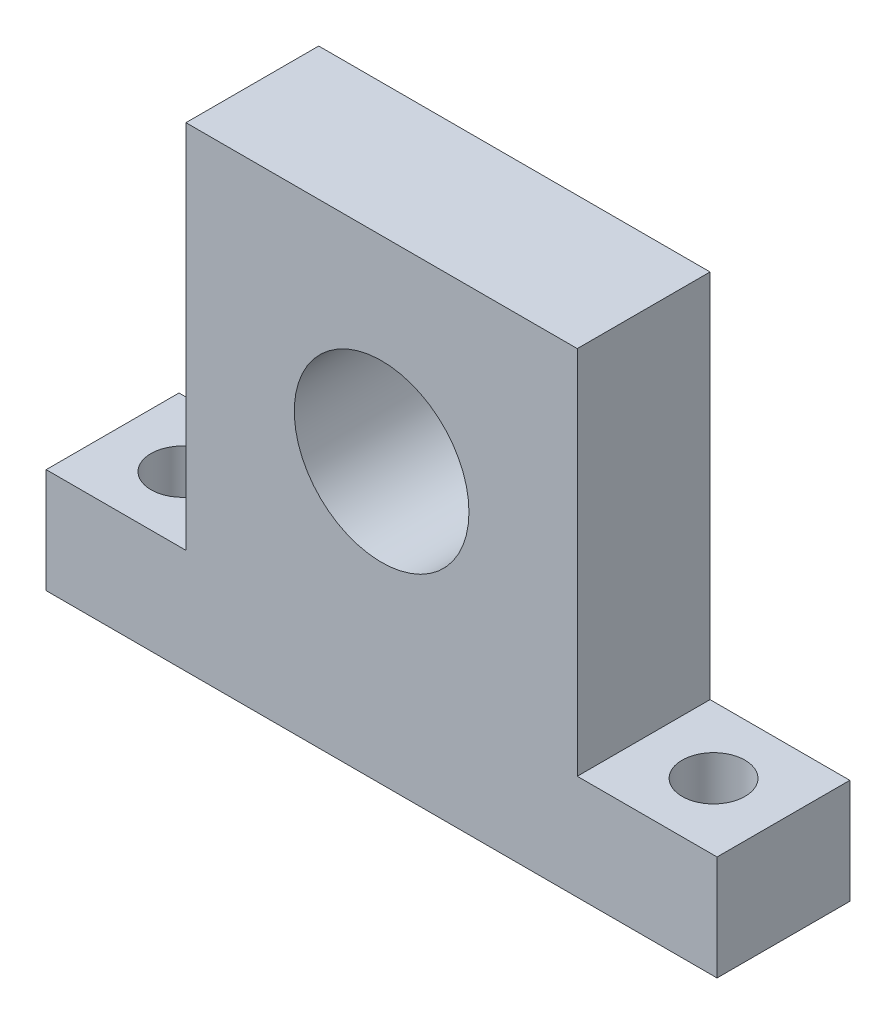
ISO-10303-21;
HEADER;
FILE_DESCRIPTION(('STEP AP214'),'2;1');
FILE_NAME('part.step','',(''),(''),'','','');
FILE_SCHEMA(('AUTOMOTIVE_DESIGN { 1 0 10303 214 1 1 1 1 }'));
ENDSEC;
DATA;
#1=APPLICATION_CONTEXT('core data for automotive mechanical design processes');
#2=APPLICATION_PROTOCOL_DEFINITION('international standard','automotive_design',2000,#1);
#3=PRODUCT_CONTEXT('',#1,'mechanical');
#4=PRODUCT('Part','Part','',(#3));
#5=PRODUCT_RELATED_PRODUCT_CATEGORY('part','',(#4));
#6=PRODUCT_DEFINITION_FORMATION('','',#4);
#7=PRODUCT_DEFINITION_CONTEXT('part definition',#1,'design');
#8=PRODUCT_DEFINITION('design','',#6,#7);
#9=PRODUCT_DEFINITION_SHAPE('','',#8);
#10=(LENGTH_UNIT() NAMED_UNIT(*) SI_UNIT(.MILLI.,.METRE.));
#11=(NAMED_UNIT(*) PLANE_ANGLE_UNIT() SI_UNIT($,.RADIAN.));
#12=(NAMED_UNIT(*) SI_UNIT($,.STERADIAN.) SOLID_ANGLE_UNIT());
#13=UNCERTAINTY_MEASURE_WITH_UNIT(LENGTH_MEASURE(1.E-05),#10,'distance_accuracy_value','');
#14=(GEOMETRIC_REPRESENTATION_CONTEXT(3) GLOBAL_UNCERTAINTY_ASSIGNED_CONTEXT((#13)) GLOBAL_UNIT_ASSIGNED_CONTEXT((#10,
#11,#12)) REPRESENTATION_CONTEXT('',''));
#15=CARTESIAN_POINT('',(0.,0.,0.));
#16=DIRECTION('',(0.,0.,1.));
#17=DIRECTION('',(1.,0.,0.));
#18=AXIS2_PLACEMENT_3D('',#15,#16,#17);
#19=CARTESIAN_POINT('',(0.,0.,19.));
#20=DIRECTION('',(0.,0.,1.));
#21=DIRECTION('',(1.,0.,0.));
#22=AXIS2_PLACEMENT_3D('',#19,#20,#21);
#23=PLANE('',#22);
#24=DIRECTION('',(1.,0.,0.));
#25=VECTOR('',#24,1.);
#26=CARTESIAN_POINT('',(-48.,-40.,19.));
#27=LINE('',#26,#25);
#28=CARTESIAN_POINT('',(-48.,-40.,19.));
#29=VERTEX_POINT('',#28);
#30=CARTESIAN_POINT('',(48.,-40.,19.));
#31=VERTEX_POINT('',#30);
#32=EDGE_CURVE('E153',#29,#31,#27,.T.);
#33=ORIENTED_EDGE('',*,*,#32,.T.);
#34=DIRECTION('',(0.,1.,0.));
#35=VECTOR('',#34,1.);
#36=CARTESIAN_POINT('',(48.,-40.,19.));
#37=LINE('',#36,#35);
#38=CARTESIAN_POINT('',(48.,-25.,19.));
#39=VERTEX_POINT('',#38);
#40=EDGE_CURVE('E101',#31,#39,#37,.T.);
#41=ORIENTED_EDGE('',*,*,#40,.T.);
#42=DIRECTION('',(-1.,0.,0.));
#43=VECTOR('',#42,1.);
#44=CARTESIAN_POINT('',(48.,-25.,19.));
#45=LINE('',#44,#43);
#46=CARTESIAN_POINT('',(28.,-25.,19.));
#47=VERTEX_POINT('',#46);
#48=EDGE_CURVE('E168',#39,#47,#45,.T.);
#49=ORIENTED_EDGE('',*,*,#48,.T.);
#50=DIRECTION('',(0.,1.,0.));
#51=VECTOR('',#50,1.);
#52=CARTESIAN_POINT('',(28.,-25.,19.));
#53=LINE('',#52,#51);
#54=CARTESIAN_POINT('',(28.,28.,19.));
#55=VERTEX_POINT('',#54);
#56=EDGE_CURVE('E181',#47,#55,#53,.T.);
#57=ORIENTED_EDGE('',*,*,#56,.T.);
#58=DIRECTION('',(-1.,0.,0.));
#59=VECTOR('',#58,1.);
#60=CARTESIAN_POINT('',(-28.,28.,19.));
#61=LINE('',#60,#59);
#62=CARTESIAN_POINT('',(-28.,28.,19.));
#63=VERTEX_POINT('',#62);
#64=EDGE_CURVE('E120',#55,#63,#61,.T.);
#65=ORIENTED_EDGE('',*,*,#64,.T.);
#66=DIRECTION('',(0.,-1.,0.));
#67=VECTOR('',#66,1.);
#68=CARTESIAN_POINT('',(-28.,-25.,19.));
#69=LINE('',#68,#67);
#70=CARTESIAN_POINT('',(-28.,-25.,19.));
#71=VERTEX_POINT('',#70);
#72=EDGE_CURVE('E114',#63,#71,#69,.T.);
#73=ORIENTED_EDGE('',*,*,#72,.T.);
#74=DIRECTION('',(-1.,0.,0.));
#75=VECTOR('',#74,1.);
#76=CARTESIAN_POINT('',(-48.,-25.,19.));
#77=LINE('',#76,#75);
#78=CARTESIAN_POINT('',(-48.,-25.,19.));
#79=VERTEX_POINT('',#78);
#80=EDGE_CURVE('E118',#71,#79,#77,.T.);
#81=ORIENTED_EDGE('',*,*,#80,.T.);
#82=DIRECTION('',(0.,-1.,0.));
#83=VECTOR('',#82,1.);
#84=CARTESIAN_POINT('',(-48.,-40.,19.));
#85=LINE('',#84,#83);
#86=EDGE_CURVE('E58',#79,#29,#85,.T.);
#87=ORIENTED_EDGE('',*,*,#86,.T.);
#88=EDGE_LOOP('',(#33,#41,#49,#57,#65,#73,#81,#87));
#89=FACE_BOUND('',#88,.T.);
#90=CARTESIAN_POINT('',(0.,0.,19.));
#91=DIRECTION('',(0.,0.,1.));
#92=DIRECTION('',(1.,0.,0.));
#93=AXIS2_PLACEMENT_3D('',#90,#91,#92);
#94=CIRCLE('',#93,12.5);
#95=CARTESIAN_POINT('',(12.5,0.,19.));
#96=VERTEX_POINT('',#95);
#97=EDGE_CURVE('E142',#96,#96,#94,.T.);
#98=ORIENTED_EDGE('',*,*,#97,.F.);
#99=EDGE_LOOP('',(#98));
#100=FACE_BOUND('',#99,.T.);
#101=ADVANCED_FACE('F41',(#89,#100),#23,.T.);
#102=CARTESIAN_POINT('',(0.,0.,0.));
#103=DIRECTION('',(0.,0.,1.));
#104=DIRECTION('',(1.,0.,0.));
#105=AXIS2_PLACEMENT_3D('',#102,#103,#104);
#106=PLANE('',#105);
#107=DIRECTION('',(1.,0.,0.));
#108=VECTOR('',#107,1.);
#109=CARTESIAN_POINT('',(-48.,-40.,0.));
#110=LINE('',#109,#108);
#111=CARTESIAN_POINT('',(-48.,-40.,0.));
#112=VERTEX_POINT('',#111);
#113=CARTESIAN_POINT('',(48.,-40.,0.));
#114=VERTEX_POINT('',#113);
#115=EDGE_CURVE('E138',#112,#114,#110,.T.);
#116=ORIENTED_EDGE('',*,*,#115,.F.);
#117=DIRECTION('',(0.,-1.,0.));
#118=VECTOR('',#117,1.);
#119=CARTESIAN_POINT('',(-48.,-40.,0.));
#120=LINE('',#119,#118);
#121=CARTESIAN_POINT('',(-48.,-25.,0.));
#122=VERTEX_POINT('',#121);
#123=EDGE_CURVE('E93',#122,#112,#120,.T.);
#124=ORIENTED_EDGE('',*,*,#123,.F.);
#125=DIRECTION('',(-1.,0.,0.));
#126=VECTOR('',#125,1.);
#127=CARTESIAN_POINT('',(-48.,-25.,0.));
#128=LINE('',#127,#126);
#129=CARTESIAN_POINT('',(-28.,-25.,0.));
#130=VERTEX_POINT('',#129);
#131=EDGE_CURVE('E87',#130,#122,#128,.T.);
#132=ORIENTED_EDGE('',*,*,#131,.F.);
#133=DIRECTION('',(0.,-1.,0.));
#134=VECTOR('',#133,1.);
#135=CARTESIAN_POINT('',(-28.,-25.,0.));
#136=LINE('',#135,#134);
#137=CARTESIAN_POINT('',(-28.,28.,0.));
#138=VERTEX_POINT('',#137);
#139=EDGE_CURVE('E128',#138,#130,#136,.T.);
#140=ORIENTED_EDGE('',*,*,#139,.F.);
#141=DIRECTION('',(-1.,0.,0.));
#142=VECTOR('',#141,1.);
#143=CARTESIAN_POINT('',(-28.,28.,0.));
#144=LINE('',#143,#142);
#145=CARTESIAN_POINT('',(28.,28.,0.));
#146=VERTEX_POINT('',#145);
#147=EDGE_CURVE('E148',#146,#138,#144,.T.);
#148=ORIENTED_EDGE('',*,*,#147,.F.);
#149=DIRECTION('',(0.,1.,0.));
#150=VECTOR('',#149,1.);
#151=CARTESIAN_POINT('',(28.,-25.,0.));
#152=LINE('',#151,#150);
#153=CARTESIAN_POINT('',(28.,-25.,0.));
#154=VERTEX_POINT('',#153);
#155=EDGE_CURVE('E146',#154,#146,#152,.T.);
#156=ORIENTED_EDGE('',*,*,#155,.F.);
#157=DIRECTION('',(-1.,0.,0.));
#158=VECTOR('',#157,1.);
#159=CARTESIAN_POINT('',(48.,-25.,0.));
#160=LINE('',#159,#158);
#161=CARTESIAN_POINT('',(48.,-25.,0.));
#162=VERTEX_POINT('',#161);
#163=EDGE_CURVE('E144',#162,#154,#160,.T.);
#164=ORIENTED_EDGE('',*,*,#163,.F.);
#165=DIRECTION('',(0.,1.,0.));
#166=VECTOR('',#165,1.);
#167=CARTESIAN_POINT('',(48.,-40.,0.));
#168=LINE('',#167,#166);
#169=EDGE_CURVE('E141',#114,#162,#168,.T.);
#170=ORIENTED_EDGE('',*,*,#169,.F.);
#171=EDGE_LOOP('',(#116,#124,#132,#140,#148,#156,#164,#170));
#172=FACE_BOUND('',#171,.T.);
#173=CARTESIAN_POINT('',(0.,0.,0.));
#174=DIRECTION('',(0.,0.,1.));
#175=DIRECTION('',(1.,0.,0.));
#176=AXIS2_PLACEMENT_3D('',#173,#174,#175);
#177=CIRCLE('',#176,12.5);
#178=CARTESIAN_POINT('',(12.5,0.,0.));
#179=VERTEX_POINT('',#178);
#180=EDGE_CURVE('E187',#179,#179,#177,.T.);
#181=ORIENTED_EDGE('',*,*,#180,.T.);
#182=EDGE_LOOP('',(#181));
#183=FACE_BOUND('',#182,.T.);
#184=ADVANCED_FACE('F172',(#172,#183),#106,.F.);
#185=CARTESIAN_POINT('',(-48.,-40.,19.));
#186=DIRECTION('',(0.,1.,0.));
#187=DIRECTION('',(0.,0.,1.));
#188=AXIS2_PLACEMENT_3D('',#185,#186,#187);
#189=PLANE('',#188);
#190=CARTESIAN_POINT('',(-38.,-40.,9.5));
#191=DIRECTION('',(0.,1.,0.));
#192=DIRECTION('',(0.,0.,1.));
#193=AXIS2_PLACEMENT_3D('',#190,#191,#192);
#194=CIRCLE('',#193,4.5);
#195=CARTESIAN_POINT('',(-38.,-40.,14.));
#196=VERTEX_POINT('',#195);
#197=EDGE_CURVE('E190',#196,#196,#194,.T.);
#198=ORIENTED_EDGE('',*,*,#197,.T.);
#199=EDGE_LOOP('',(#198));
#200=FACE_BOUND('',#199,.T.);
#201=CARTESIAN_POINT('',(38.,-40.,9.50000000000002));
#202=DIRECTION('',(0.,1.,0.));
#203=DIRECTION('',(0.,0.,-1.));
#204=AXIS2_PLACEMENT_3D('',#201,#202,#203);
#205=CIRCLE('',#204,4.5);
#206=CARTESIAN_POINT('',(38.,-40.,5.00000000000002));
#207=VERTEX_POINT('',#206);
#208=EDGE_CURVE('E193',#207,#207,#205,.T.);
#209=ORIENTED_EDGE('',*,*,#208,.T.);
#210=EDGE_LOOP('',(#209));
#211=FACE_BOUND('',#210,.T.);
#212=ORIENTED_EDGE('',*,*,#115,.T.);
#213=DIRECTION('',(0.,0.,-1.));
#214=VECTOR('',#213,1.);
#215=CARTESIAN_POINT('',(48.,-40.,19.));
#216=LINE('',#215,#214);
#217=EDGE_CURVE('E11',#31,#114,#216,.T.);
#218=ORIENTED_EDGE('',*,*,#217,.F.);
#219=ORIENTED_EDGE('',*,*,#32,.F.);
#220=DIRECTION('',(0.,0.,-1.));
#221=VECTOR('',#220,1.);
#222=CARTESIAN_POINT('',(-48.,-40.,19.));
#223=LINE('',#222,#221);
#224=EDGE_CURVE('E134',#29,#112,#223,.T.);
#225=ORIENTED_EDGE('',*,*,#224,.T.);
#226=EDGE_LOOP('',(#212,#218,#219,#225));
#227=FACE_BOUND('',#226,.T.);
#228=ADVANCED_FACE('F43',(#200,#211,#227),#189,.F.);
#229=CARTESIAN_POINT('',(48.,-40.,19.));
#230=DIRECTION('',(-1.,0.,0.));
#231=DIRECTION('',(0.,0.,1.));
#232=AXIS2_PLACEMENT_3D('',#229,#230,#231);
#233=PLANE('',#232);
#234=ORIENTED_EDGE('',*,*,#169,.T.);
#235=DIRECTION('',(0.,0.,-1.));
#236=VECTOR('',#235,1.);
#237=CARTESIAN_POINT('',(48.,-25.,19.));
#238=LINE('',#237,#236);
#239=EDGE_CURVE('E50',#39,#162,#238,.T.);
#240=ORIENTED_EDGE('',*,*,#239,.F.);
#241=ORIENTED_EDGE('',*,*,#40,.F.);
#242=ORIENTED_EDGE('',*,*,#217,.T.);
#243=EDGE_LOOP('',(#234,#240,#241,#242));
#244=FACE_BOUND('',#243,.T.);
#245=ADVANCED_FACE('F243',(#244),#233,.F.);
#246=CARTESIAN_POINT('',(48.,-25.,19.));
#247=DIRECTION('',(0.,-1.,0.));
#248=DIRECTION('',(0.,0.,-1.));
#249=AXIS2_PLACEMENT_3D('',#246,#247,#248);
#250=PLANE('',#249);
#251=CARTESIAN_POINT('',(38.,-25.,9.50000000000002));
#252=DIRECTION('',(0.,1.,0.));
#253=DIRECTION('',(0.,0.,-1.));
#254=AXIS2_PLACEMENT_3D('',#251,#252,#253);
#255=CIRCLE('',#254,4.5);
#256=CARTESIAN_POINT('',(38.,-25.,5.00000000000002));
#257=VERTEX_POINT('',#256);
#258=EDGE_CURVE('E196',#257,#257,#255,.T.);
#259=ORIENTED_EDGE('',*,*,#258,.F.);
#260=EDGE_LOOP('',(#259));
#261=FACE_BOUND('',#260,.T.);
#262=ORIENTED_EDGE('',*,*,#163,.T.);
#263=DIRECTION('',(0.,0.,-1.));
#264=VECTOR('',#263,1.);
#265=CARTESIAN_POINT('',(28.,-25.,19.));
#266=LINE('',#265,#264);
#267=EDGE_CURVE('E160',#47,#154,#266,.T.);
#268=ORIENTED_EDGE('',*,*,#267,.F.);
#269=ORIENTED_EDGE('',*,*,#48,.F.);
#270=ORIENTED_EDGE('',*,*,#239,.T.);
#271=EDGE_LOOP('',(#262,#268,#269,#270));
#272=FACE_BOUND('',#271,.T.);
#273=ADVANCED_FACE('F166',(#261,#272),#250,.F.);
#274=CARTESIAN_POINT('',(28.,-25.,19.));
#275=DIRECTION('',(-1.,0.,0.));
#276=DIRECTION('',(0.,0.,1.));
#277=AXIS2_PLACEMENT_3D('',#274,#275,#276);
#278=PLANE('',#277);
#279=ORIENTED_EDGE('',*,*,#155,.T.);
#280=DIRECTION('',(0.,0.,-1.));
#281=VECTOR('',#280,1.);
#282=CARTESIAN_POINT('',(28.,28.,19.));
#283=LINE('',#282,#281);
#284=EDGE_CURVE('E157',#55,#146,#283,.T.);
#285=ORIENTED_EDGE('',*,*,#284,.F.);
#286=ORIENTED_EDGE('',*,*,#56,.F.);
#287=ORIENTED_EDGE('',*,*,#267,.T.);
#288=EDGE_LOOP('',(#279,#285,#286,#287));
#289=FACE_BOUND('',#288,.T.);
#290=ADVANCED_FACE('F177',(#289),#278,.F.);
#291=CARTESIAN_POINT('',(-28.,28.,19.));
#292=DIRECTION('',(0.,-1.,0.));
#293=DIRECTION('',(0.,0.,-1.));
#294=AXIS2_PLACEMENT_3D('',#291,#292,#293);
#295=PLANE('',#294);
#296=ORIENTED_EDGE('',*,*,#147,.T.);
#297=DIRECTION('',(0.,0.,-1.));
#298=VECTOR('',#297,1.);
#299=CARTESIAN_POINT('',(-28.,28.,19.));
#300=LINE('',#299,#298);
#301=EDGE_CURVE('E129',#63,#138,#300,.T.);
#302=ORIENTED_EDGE('',*,*,#301,.F.);
#303=ORIENTED_EDGE('',*,*,#64,.F.);
#304=ORIENTED_EDGE('',*,*,#284,.T.);
#305=EDGE_LOOP('',(#296,#302,#303,#304));
#306=FACE_BOUND('',#305,.T.);
#307=ADVANCED_FACE('F180',(#306),#295,.F.);
#308=CARTESIAN_POINT('',(-28.,-25.,19.));
#309=DIRECTION('',(1.,0.,0.));
#310=DIRECTION('',(0.,0.,-1.));
#311=AXIS2_PLACEMENT_3D('',#308,#309,#310);
#312=PLANE('',#311);
#313=ORIENTED_EDGE('',*,*,#139,.T.);
#314=DIRECTION('',(0.,0.,-1.));
#315=VECTOR('',#314,1.);
#316=CARTESIAN_POINT('',(-28.,-25.,19.));
#317=LINE('',#316,#315);
#318=EDGE_CURVE('E125',#71,#130,#317,.T.);
#319=ORIENTED_EDGE('',*,*,#318,.F.);
#320=ORIENTED_EDGE('',*,*,#72,.F.);
#321=ORIENTED_EDGE('',*,*,#301,.T.);
#322=EDGE_LOOP('',(#313,#319,#320,#321));
#323=FACE_BOUND('',#322,.T.);
#324=ADVANCED_FACE('F126',(#323),#312,.F.);
#325=CARTESIAN_POINT('',(-48.,-25.,19.));
#326=DIRECTION('',(0.,-1.,0.));
#327=DIRECTION('',(0.,0.,-1.));
#328=AXIS2_PLACEMENT_3D('',#325,#326,#327);
#329=PLANE('',#328);
#330=CARTESIAN_POINT('',(-38.,-25.,9.5));
#331=DIRECTION('',(0.,1.,0.));
#332=DIRECTION('',(0.,0.,1.));
#333=AXIS2_PLACEMENT_3D('',#330,#331,#332);
#334=CIRCLE('',#333,4.5);
#335=CARTESIAN_POINT('',(-38.,-25.,14.));
#336=VERTEX_POINT('',#335);
#337=EDGE_CURVE('E199',#336,#336,#334,.T.);
#338=ORIENTED_EDGE('',*,*,#337,.F.);
#339=EDGE_LOOP('',(#338));
#340=FACE_BOUND('',#339,.T.);
#341=ORIENTED_EDGE('',*,*,#131,.T.);
#342=DIRECTION('',(0.,0.,-1.));
#343=VECTOR('',#342,1.);
#344=CARTESIAN_POINT('',(-48.,-25.,19.));
#345=LINE('',#344,#343);
#346=EDGE_CURVE('E130',#79,#122,#345,.T.);
#347=ORIENTED_EDGE('',*,*,#346,.F.);
#348=ORIENTED_EDGE('',*,*,#80,.F.);
#349=ORIENTED_EDGE('',*,*,#318,.T.);
#350=EDGE_LOOP('',(#341,#347,#348,#349));
#351=FACE_BOUND('',#350,.T.);
#352=ADVANCED_FACE('F132',(#340,#351),#329,.F.);
#353=CARTESIAN_POINT('',(-48.,-40.,19.));
#354=DIRECTION('',(1.,0.,0.));
#355=DIRECTION('',(0.,0.,-1.));
#356=AXIS2_PLACEMENT_3D('',#353,#354,#355);
#357=PLANE('',#356);
#358=ORIENTED_EDGE('',*,*,#123,.T.);
#359=ORIENTED_EDGE('',*,*,#224,.F.);
#360=ORIENTED_EDGE('',*,*,#86,.F.);
#361=ORIENTED_EDGE('',*,*,#346,.T.);
#362=EDGE_LOOP('',(#358,#359,#360,#361));
#363=FACE_BOUND('',#362,.T.);
#364=ADVANCED_FACE('F216',(#363),#357,.F.);
#365=CARTESIAN_POINT('',(0.,0.,19.));
#366=DIRECTION('',(0.,0.,-1.));
#367=DIRECTION('',(-1.,0.,0.));
#368=AXIS2_PLACEMENT_3D('',#365,#366,#367);
#369=CYLINDRICAL_SURFACE('',#368,12.5);
#370=ORIENTED_EDGE('',*,*,#97,.T.);
#371=EDGE_LOOP('',(#370));
#372=FACE_BOUND('',#371,.T.);
#373=ORIENTED_EDGE('',*,*,#180,.F.);
#374=EDGE_LOOP('',(#373));
#375=FACE_BOUND('',#374,.T.);
#376=ADVANCED_FACE('F211',(#372,#375),#369,.F.);
#377=CARTESIAN_POINT('',(-38.,-40.,9.5));
#378=DIRECTION('',(0.,1.,0.));
#379=DIRECTION('',(0.,0.,1.));
#380=AXIS2_PLACEMENT_3D('',#377,#378,#379);
#381=CYLINDRICAL_SURFACE('',#380,4.5);
#382=ORIENTED_EDGE('',*,*,#197,.F.);
#383=EDGE_LOOP('',(#382));
#384=FACE_BOUND('',#383,.T.);
#385=ORIENTED_EDGE('',*,*,#337,.T.);
#386=EDGE_LOOP('',(#385));
#387=FACE_BOUND('',#386,.T.);
#388=ADVANCED_FACE('F207',(#384,#387),#381,.F.);
#389=CARTESIAN_POINT('',(38.,-40.,9.50000000000002));
#390=DIRECTION('',(0.,1.,0.));
#391=DIRECTION('',(0.,0.,1.));
#392=AXIS2_PLACEMENT_3D('',#389,#390,#391);
#393=CYLINDRICAL_SURFACE('',#392,4.5);
#394=ORIENTED_EDGE('',*,*,#208,.F.);
#395=EDGE_LOOP('',(#394));
#396=FACE_BOUND('',#395,.T.);
#397=ORIENTED_EDGE('',*,*,#258,.T.);
#398=EDGE_LOOP('',(#397));
#399=FACE_BOUND('',#398,.T.);
#400=ADVANCED_FACE('F210',(#396,#399),#393,.F.);
#401=CLOSED_SHELL('',(#101,#184,#228,#245,#273,#290,#307,#324,#352,#364,#376,#388,#400));
#402=MANIFOLD_SOLID_BREP('B2',#401);
#403=ADVANCED_BREP_SHAPE_REPRESENTATION('',(#18,#402),#14);
#404=SHAPE_DEFINITION_REPRESENTATION(#9,#403);
ENDSEC;
END-ISO-10303-21;
